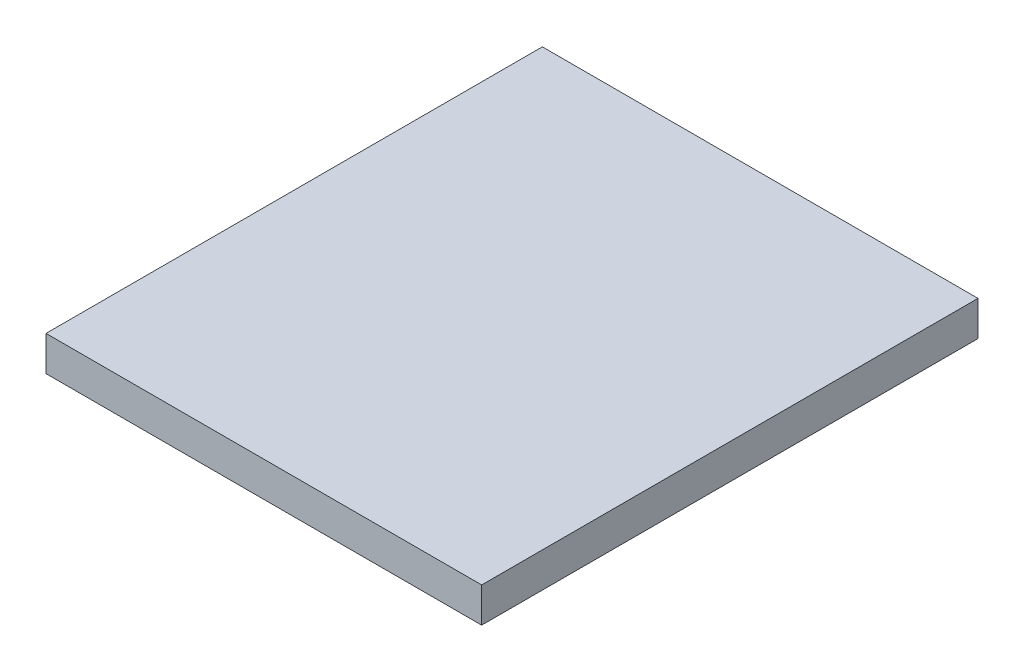
ISO-10303-21;
HEADER;
FILE_DESCRIPTION(('STEP AP214'),'2;1');
FILE_NAME('part.step','',(''),(''),'','','');
FILE_SCHEMA(('AUTOMOTIVE_DESIGN { 1 0 10303 214 1 1 1 1 }'));
ENDSEC;
DATA;
#1=APPLICATION_CONTEXT('core data for automotive mechanical design processes');
#2=APPLICATION_PROTOCOL_DEFINITION('international standard','automotive_design',2000,#1);
#3=PRODUCT_CONTEXT('',#1,'mechanical');
#4=PRODUCT('Part','Part','',(#3));
#5=PRODUCT_RELATED_PRODUCT_CATEGORY('part','',(#4));
#6=PRODUCT_DEFINITION_FORMATION('','',#4);
#7=PRODUCT_DEFINITION_CONTEXT('part definition',#1,'design');
#8=PRODUCT_DEFINITION('design','',#6,#7);
#9=PRODUCT_DEFINITION_SHAPE('','',#8);
#10=(LENGTH_UNIT() NAMED_UNIT(*) SI_UNIT(.MILLI.,.METRE.));
#11=(NAMED_UNIT(*) PLANE_ANGLE_UNIT() SI_UNIT($,.RADIAN.));
#12=(NAMED_UNIT(*) SI_UNIT($,.STERADIAN.) SOLID_ANGLE_UNIT());
#13=UNCERTAINTY_MEASURE_WITH_UNIT(LENGTH_MEASURE(1.E-05),#10,'distance_accuracy_value','');
#14=(GEOMETRIC_REPRESENTATION_CONTEXT(3) GLOBAL_UNCERTAINTY_ASSIGNED_CONTEXT((#13)) GLOBAL_UNIT_ASSIGNED_CONTEXT((#10,
#11,#12)) REPRESENTATION_CONTEXT('',''));
#15=CARTESIAN_POINT('',(0.,0.,0.));
#16=DIRECTION('',(0.,0.,1.));
#17=DIRECTION('',(1.,0.,0.));
#18=AXIS2_PLACEMENT_3D('',#15,#16,#17);
#19=CARTESIAN_POINT('',(0.,8.,0.));
#20=DIRECTION('',(1.,0.,0.));
#21=DIRECTION('',(0.,0.,-1.));
#22=AXIS2_PLACEMENT_3D('',#19,#20,#21);
#23=PLANE('',#22);
#24=DIRECTION('',(0.,0.,1.));
#25=VECTOR('',#24,1.);
#26=CARTESIAN_POINT('',(0.,0.,0.));
#27=LINE('',#26,#25);
#28=CARTESIAN_POINT('',(0.,0.,-113.93));
#29=VERTEX_POINT('',#28);
#30=CARTESIAN_POINT('',(0.,0.,0.));
#31=VERTEX_POINT('',#30);
#32=EDGE_CURVE('E101',#29,#31,#27,.T.);
#33=ORIENTED_EDGE('',*,*,#32,.T.);
#34=DIRECTION('',(0.,-1.,0.));
#35=VECTOR('',#34,1.);
#36=CARTESIAN_POINT('',(0.,8.,0.));
#37=LINE('',#36,#35);
#38=CARTESIAN_POINT('',(0.,8.,0.));
#39=VERTEX_POINT('',#38);
#40=EDGE_CURVE('E11',#39,#31,#37,.T.);
#41=ORIENTED_EDGE('',*,*,#40,.F.);
#42=DIRECTION('',(0.,0.,1.));
#43=VECTOR('',#42,1.);
#44=CARTESIAN_POINT('',(0.,8.,0.));
#45=LINE('',#44,#43);
#46=CARTESIAN_POINT('',(0.,8.,-113.93));
#47=VERTEX_POINT('',#46);
#48=EDGE_CURVE('E89',#47,#39,#45,.T.);
#49=ORIENTED_EDGE('',*,*,#48,.F.);
#50=DIRECTION('',(0.,-1.,0.));
#51=VECTOR('',#50,1.);
#52=CARTESIAN_POINT('',(0.,8.,-113.93));
#53=LINE('',#52,#51);
#54=EDGE_CURVE('E97',#47,#29,#53,.T.);
#55=ORIENTED_EDGE('',*,*,#54,.T.);
#56=EDGE_LOOP('',(#33,#41,#49,#55));
#57=FACE_BOUND('',#56,.T.);
#58=ADVANCED_FACE('F38',(#57),#23,.F.);
#59=CARTESIAN_POINT('',(0.,8.,0.));
#60=DIRECTION('',(0.,0.,-1.));
#61=DIRECTION('',(-1.,0.,0.));
#62=AXIS2_PLACEMENT_3D('',#59,#60,#61);
#63=PLANE('',#62);
#64=DIRECTION('',(1.,0.,0.));
#65=VECTOR('',#64,1.);
#66=CARTESIAN_POINT('',(0.,0.,0.));
#67=LINE('',#66,#65);
#68=CARTESIAN_POINT('',(100.,0.,0.));
#69=VERTEX_POINT('',#68);
#70=EDGE_CURVE('E93',#31,#69,#67,.T.);
#71=ORIENTED_EDGE('',*,*,#70,.T.);
#72=DIRECTION('',(0.,-1.,0.));
#73=VECTOR('',#72,1.);
#74=CARTESIAN_POINT('',(100.,8.,0.));
#75=LINE('',#74,#73);
#76=CARTESIAN_POINT('',(100.,8.,0.));
#77=VERTEX_POINT('',#76);
#78=EDGE_CURVE('E46',#77,#69,#75,.T.);
#79=ORIENTED_EDGE('',*,*,#78,.F.);
#80=DIRECTION('',(1.,0.,0.));
#81=VECTOR('',#80,1.);
#82=CARTESIAN_POINT('',(0.,8.,0.));
#83=LINE('',#82,#81);
#84=EDGE_CURVE('E84',#39,#77,#83,.T.);
#85=ORIENTED_EDGE('',*,*,#84,.F.);
#86=ORIENTED_EDGE('',*,*,#40,.T.);
#87=EDGE_LOOP('',(#71,#79,#85,#86));
#88=FACE_BOUND('',#87,.T.);
#89=ADVANCED_FACE('F92',(#88),#63,.F.);
#90=CARTESIAN_POINT('',(100.,8.,0.));
#91=DIRECTION('',(-1.,0.,0.));
#92=DIRECTION('',(0.,0.,1.));
#93=AXIS2_PLACEMENT_3D('',#90,#91,#92);
#94=PLANE('',#93);
#95=DIRECTION('',(0.,0.,-1.));
#96=VECTOR('',#95,1.);
#97=CARTESIAN_POINT('',(100.,0.,0.));
#98=LINE('',#97,#96);
#99=CARTESIAN_POINT('',(100.,0.,-113.93));
#100=VERTEX_POINT('',#99);
#101=EDGE_CURVE('E71',#69,#100,#98,.T.);
#102=ORIENTED_EDGE('',*,*,#101,.T.);
#103=DIRECTION('',(0.,-1.,0.));
#104=VECTOR('',#103,1.);
#105=CARTESIAN_POINT('',(100.,8.,-113.93));
#106=LINE('',#105,#104);
#107=CARTESIAN_POINT('',(100.,8.,-113.93));
#108=VERTEX_POINT('',#107);
#109=EDGE_CURVE('E94',#108,#100,#106,.T.);
#110=ORIENTED_EDGE('',*,*,#109,.F.);
#111=DIRECTION('',(0.,0.,-1.));
#112=VECTOR('',#111,1.);
#113=CARTESIAN_POINT('',(100.,8.,0.));
#114=LINE('',#113,#112);
#115=EDGE_CURVE('E87',#77,#108,#114,.T.);
#116=ORIENTED_EDGE('',*,*,#115,.F.);
#117=ORIENTED_EDGE('',*,*,#78,.T.);
#118=EDGE_LOOP('',(#102,#110,#116,#117));
#119=FACE_BOUND('',#118,.T.);
#120=ADVANCED_FACE('F95',(#119),#94,.F.);
#121=CARTESIAN_POINT('',(0.,8.,-113.93));
#122=DIRECTION('',(0.,0.,1.));
#123=DIRECTION('',(1.,0.,0.));
#124=AXIS2_PLACEMENT_3D('',#121,#122,#123);
#125=PLANE('',#124);
#126=DIRECTION('',(-1.,0.,0.));
#127=VECTOR('',#126,1.);
#128=CARTESIAN_POINT('',(0.,0.,-113.93));
#129=LINE('',#128,#127);
#130=EDGE_CURVE('E77',#100,#29,#129,.T.);
#131=ORIENTED_EDGE('',*,*,#130,.T.);
#132=ORIENTED_EDGE('',*,*,#54,.F.);
#133=DIRECTION('',(-1.,0.,0.));
#134=VECTOR('',#133,1.);
#135=CARTESIAN_POINT('',(0.,8.,-113.93));
#136=LINE('',#135,#134);
#137=EDGE_CURVE('E54',#108,#47,#136,.T.);
#138=ORIENTED_EDGE('',*,*,#137,.F.);
#139=ORIENTED_EDGE('',*,*,#109,.T.);
#140=EDGE_LOOP('',(#131,#132,#138,#139));
#141=FACE_BOUND('',#140,.T.);
#142=ADVANCED_FACE('F108',(#141),#125,.F.);
#143=CARTESIAN_POINT('',(0.,8.,0.));
#144=DIRECTION('',(0.,-1.,0.));
#145=DIRECTION('',(0.,0.,-1.));
#146=AXIS2_PLACEMENT_3D('',#143,#144,#145);
#147=PLANE('',#146);
#148=ORIENTED_EDGE('',*,*,#48,.T.);
#149=ORIENTED_EDGE('',*,*,#84,.T.);
#150=ORIENTED_EDGE('',*,*,#115,.T.);
#151=ORIENTED_EDGE('',*,*,#137,.T.);
#152=EDGE_LOOP('',(#148,#149,#150,#151));
#153=FACE_BOUND('',#152,.T.);
#154=ADVANCED_FACE('F85',(#153),#147,.F.);
#155=CARTESIAN_POINT('',(0.,0.,0.));
#156=DIRECTION('',(0.,-1.,0.));
#157=DIRECTION('',(0.,0.,-1.));
#158=AXIS2_PLACEMENT_3D('',#155,#156,#157);
#159=PLANE('',#158);
#160=ORIENTED_EDGE('',*,*,#32,.F.);
#161=ORIENTED_EDGE('',*,*,#130,.F.);
#162=ORIENTED_EDGE('',*,*,#101,.F.);
#163=ORIENTED_EDGE('',*,*,#70,.F.);
#164=EDGE_LOOP('',(#160,#161,#162,#163));
#165=FACE_BOUND('',#164,.T.);
#166=ADVANCED_FACE('F111',(#165),#159,.T.);
#167=CLOSED_SHELL('',(#58,#89,#120,#142,#154,#166));
#168=MANIFOLD_SOLID_BREP('B2',#167);
#169=ADVANCED_BREP_SHAPE_REPRESENTATION('',(#18,#168),#14);
#170=SHAPE_DEFINITION_REPRESENTATION(#9,#169);
ENDSEC;
END-ISO-10303-21;
